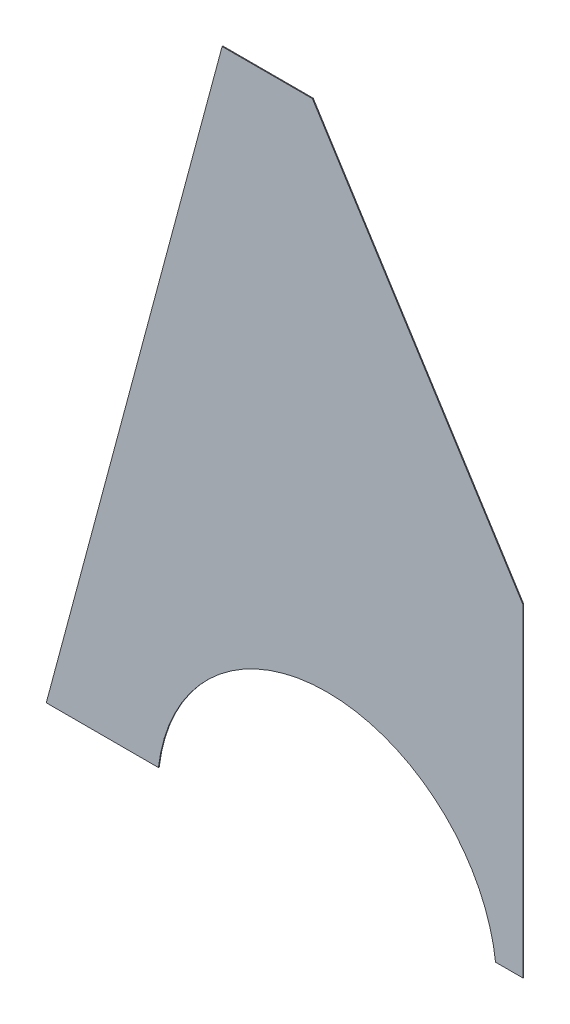
ISO-10303-21;
HEADER;
FILE_DESCRIPTION(('STEP AP214'),'2;1');
FILE_NAME('part.step','',(''),(''),'','','');
FILE_SCHEMA(('AUTOMOTIVE_DESIGN { 1 0 10303 214 1 1 1 1 }'));
ENDSEC;
DATA;
#1=APPLICATION_CONTEXT('core data for automotive mechanical design processes');
#2=APPLICATION_PROTOCOL_DEFINITION('international standard','automotive_design',2000,#1);
#3=PRODUCT_CONTEXT('',#1,'mechanical');
#4=PRODUCT('Part','Part','',(#3));
#5=PRODUCT_RELATED_PRODUCT_CATEGORY('part','',(#4));
#6=PRODUCT_DEFINITION_FORMATION('','',#4);
#7=PRODUCT_DEFINITION_CONTEXT('part definition',#1,'design');
#8=PRODUCT_DEFINITION('design','',#6,#7);
#9=PRODUCT_DEFINITION_SHAPE('','',#8);
#10=(LENGTH_UNIT() NAMED_UNIT(*) SI_UNIT(.MILLI.,.METRE.));
#11=(NAMED_UNIT(*) PLANE_ANGLE_UNIT() SI_UNIT($,.RADIAN.));
#12=(NAMED_UNIT(*) SI_UNIT($,.STERADIAN.) SOLID_ANGLE_UNIT());
#13=UNCERTAINTY_MEASURE_WITH_UNIT(LENGTH_MEASURE(1.E-05),#10,'distance_accuracy_value','');
#14=(GEOMETRIC_REPRESENTATION_CONTEXT(3) GLOBAL_UNCERTAINTY_ASSIGNED_CONTEXT((#13)) GLOBAL_UNIT_ASSIGNED_CONTEXT((#10,
#11,#12)) REPRESENTATION_CONTEXT('',''));
#15=CARTESIAN_POINT('',(0.,0.,0.));
#16=DIRECTION('',(0.,0.,1.));
#17=DIRECTION('',(1.,0.,0.));
#18=AXIS2_PLACEMENT_3D('',#15,#16,#17);
#19=CARTESIAN_POINT('',(-221.038261187071,-391.229199842486,1.5));
#20=DIRECTION('',(0.965925826289067,-0.258819045102525,0.));
#21=DIRECTION('',(0.258819045102525,0.965925826289067,0.));
#22=AXIS2_PLACEMENT_3D('',#19,#20,#21);
#23=PLANE('',#22);
#24=DIRECTION('',(-0.258819045102525,-0.965925826289067,0.));
#25=VECTOR('',#24,1.);
#26=CARTESIAN_POINT('',(-221.038261187071,-391.229199842486,0.));
#27=LINE('',#26,#25);
#28=CARTESIAN_POINT('',(100.414992830264,808.450676408536,0.));
#29=VERTEX_POINT('',#28);
#30=CARTESIAN_POINT('',(-221.038261187071,-391.229199842486,0.));
#31=VERTEX_POINT('',#30);
#32=EDGE_CURVE('E127',#29,#31,#27,.T.);
#33=ORIENTED_EDGE('',*,*,#32,.T.);
#34=DIRECTION('',(0.,0.,-1.));
#35=VECTOR('',#34,1.);
#36=CARTESIAN_POINT('',(-221.038261187071,-391.229199842486,1.5));
#37=LINE('',#36,#35);
#38=CARTESIAN_POINT('',(-221.038261187071,-391.229199842486,1.5));
#39=VERTEX_POINT('',#38);
#40=EDGE_CURVE('E11',#39,#31,#37,.T.);
#41=ORIENTED_EDGE('',*,*,#40,.F.);
#42=DIRECTION('',(-0.258819045102525,-0.965925826289067,0.));
#43=VECTOR('',#42,1.);
#44=CARTESIAN_POINT('',(-221.038261187071,-391.229199842486,1.5));
#45=LINE('',#44,#43);
#46=CARTESIAN_POINT('',(100.414992830264,808.450676408536,1.5));
#47=VERTEX_POINT('',#46);
#48=EDGE_CURVE('E139',#47,#39,#45,.T.);
#49=ORIENTED_EDGE('',*,*,#48,.F.);
#50=DIRECTION('',(0.,0.,-1.));
#51=VECTOR('',#50,1.);
#52=CARTESIAN_POINT('',(100.414992830264,808.450676408536,1.5));
#53=LINE('',#52,#51);
#54=EDGE_CURVE('E123',#47,#29,#53,.T.);
#55=ORIENTED_EDGE('',*,*,#54,.T.);
#56=EDGE_LOOP('',(#33,#41,#49,#55));
#57=FACE_BOUND('',#56,.T.);
#58=ADVANCED_FACE('F37',(#57),#23,.F.);
#59=CARTESIAN_POINT('',(-221.038261187071,-391.229199842486,1.5));
#60=DIRECTION('',(0.,1.,0.));
#61=DIRECTION('',(-1.,0.,0.));
#62=AXIS2_PLACEMENT_3D('',#59,#60,#61);
#63=PLANE('',#62);
#64=DIRECTION('',(1.,0.,0.));
#65=VECTOR('',#64,1.);
#66=CARTESIAN_POINT('',(-221.038261187071,-391.229199842486,0.));
#67=LINE('',#66,#65);
#68=CARTESIAN_POINT('',(-16.0382611870713,-391.229199842487,0.));
#69=VERTEX_POINT('',#68);
#70=EDGE_CURVE('E130',#31,#69,#67,.T.);
#71=ORIENTED_EDGE('',*,*,#70,.T.);
#72=DIRECTION('',(0.,0.,-1.));
#73=VECTOR('',#72,1.);
#74=CARTESIAN_POINT('',(-16.0382611870713,-391.229199842487,1.5));
#75=LINE('',#74,#73);
#76=CARTESIAN_POINT('',(-16.0382611870713,-391.229199842487,1.5));
#77=VERTEX_POINT('',#76);
#78=EDGE_CURVE('E45',#77,#69,#75,.T.);
#79=ORIENTED_EDGE('',*,*,#78,.F.);
#80=DIRECTION('',(1.,0.,0.));
#81=VECTOR('',#80,1.);
#82=CARTESIAN_POINT('',(-221.038261187071,-391.229199842486,1.5));
#83=LINE('',#82,#81);
#84=EDGE_CURVE('E93',#39,#77,#83,.T.);
#85=ORIENTED_EDGE('',*,*,#84,.F.);
#86=ORIENTED_EDGE('',*,*,#40,.T.);
#87=EDGE_LOOP('',(#71,#79,#85,#86));
#88=FACE_BOUND('',#87,.T.);
#89=ADVANCED_FACE('F164',(#88),#63,.F.);
#90=CARTESIAN_POINT('',(292.09890257763,-427.802387643597,1.5));
#91=DIRECTION('',(0.,0.,-1.));
#92=DIRECTION('',(-1.,0.,0.));
#93=AXIS2_PLACEMENT_3D('',#90,#91,#92);
#94=CYLINDRICAL_SURFACE('',#93,310.300031838364);
#95=CARTESIAN_POINT('',(292.09890257763,-427.802387643597,0.));
#96=DIRECTION('',(0.,0.,-1.));
#97=DIRECTION('',(-1.,0.,0.));
#98=AXIS2_PLACEMENT_3D('',#95,#96,#97);
#99=CIRCLE('',#98,310.300031838364);
#100=CARTESIAN_POINT('',(600.236066342331,-391.229199842487,0.));
#101=VERTEX_POINT('',#100);
#102=EDGE_CURVE('E132',#69,#101,#99,.T.);
#103=ORIENTED_EDGE('',*,*,#102,.T.);
#104=DIRECTION('',(0.,0.,-1.));
#105=VECTOR('',#104,1.);
#106=CARTESIAN_POINT('',(600.236066342331,-391.229199842487,1.5));
#107=LINE('',#106,#105);
#108=CARTESIAN_POINT('',(600.236066342331,-391.229199842487,1.5));
#109=VERTEX_POINT('',#108);
#110=EDGE_CURVE('E143',#109,#101,#107,.T.);
#111=ORIENTED_EDGE('',*,*,#110,.F.);
#112=CARTESIAN_POINT('',(292.09890257763,-427.802387643597,1.5));
#113=DIRECTION('',(0.,0.,-1.));
#114=DIRECTION('',(-1.,0.,0.));
#115=AXIS2_PLACEMENT_3D('',#112,#113,#114);
#116=CIRCLE('',#115,310.300031838364);
#117=EDGE_CURVE('E151',#77,#109,#116,.T.);
#118=ORIENTED_EDGE('',*,*,#117,.F.);
#119=ORIENTED_EDGE('',*,*,#78,.T.);
#120=EDGE_LOOP('',(#103,#111,#118,#119));
#121=FACE_BOUND('',#120,.T.);
#122=ADVANCED_FACE('F149',(#121),#94,.F.);
#123=CARTESIAN_POINT('',(650.236066342331,-391.229199842487,1.5));
#124=DIRECTION('',(0.,1.,0.));
#125=DIRECTION('',(0.,0.,1.));
#126=AXIS2_PLACEMENT_3D('',#123,#124,#125);
#127=PLANE('',#126);
#128=DIRECTION('',(1.,0.,0.));
#129=VECTOR('',#128,1.);
#130=CARTESIAN_POINT('',(650.236066342331,-391.229199842487,0.));
#131=LINE('',#130,#129);
#132=CARTESIAN_POINT('',(650.236066342331,-391.229199842487,0.));
#133=VERTEX_POINT('',#132);
#134=EDGE_CURVE('E134',#101,#133,#131,.T.);
#135=ORIENTED_EDGE('',*,*,#134,.T.);
#136=DIRECTION('',(0.,0.,-1.));
#137=VECTOR('',#136,1.);
#138=CARTESIAN_POINT('',(650.236066342331,-391.229199842487,1.5));
#139=LINE('',#138,#137);
#140=CARTESIAN_POINT('',(650.236066342331,-391.229199842487,1.5));
#141=VERTEX_POINT('',#140);
#142=EDGE_CURVE('E118',#141,#133,#139,.T.);
#143=ORIENTED_EDGE('',*,*,#142,.F.);
#144=DIRECTION('',(1.,0.,0.));
#145=VECTOR('',#144,1.);
#146=CARTESIAN_POINT('',(650.236066342331,-391.229199842487,1.5));
#147=LINE('',#146,#145);
#148=EDGE_CURVE('E109',#109,#141,#147,.T.);
#149=ORIENTED_EDGE('',*,*,#148,.F.);
#150=ORIENTED_EDGE('',*,*,#110,.T.);
#151=EDGE_LOOP('',(#135,#143,#149,#150));
#152=FACE_BOUND('',#151,.T.);
#153=ADVANCED_FACE('F157',(#152),#127,.F.);
#154=CARTESIAN_POINT('',(650.236066342331,199.917405846424,1.5));
#155=DIRECTION('',(-1.,0.,0.));
#156=DIRECTION('',(0.,0.,1.));
#157=AXIS2_PLACEMENT_3D('',#154,#155,#156);
#158=PLANE('',#157);
#159=DIRECTION('',(0.,1.,0.));
#160=VECTOR('',#159,1.);
#161=CARTESIAN_POINT('',(650.236066342331,199.917405846424,0.));
#162=LINE('',#161,#160);
#163=CARTESIAN_POINT('',(650.236066342331,199.917405846424,0.));
#164=VERTEX_POINT('',#163);
#165=EDGE_CURVE('E117',#133,#164,#162,.T.);
#166=ORIENTED_EDGE('',*,*,#165,.T.);
#167=DIRECTION('',(0.,0.,-1.));
#168=VECTOR('',#167,1.);
#169=CARTESIAN_POINT('',(650.236066342331,199.917405846424,1.5));
#170=LINE('',#169,#168);
#171=CARTESIAN_POINT('',(650.236066342331,199.917405846424,1.5));
#172=VERTEX_POINT('',#171);
#173=EDGE_CURVE('E114',#172,#164,#170,.T.);
#174=ORIENTED_EDGE('',*,*,#173,.F.);
#175=DIRECTION('',(0.,1.,0.));
#176=VECTOR('',#175,1.);
#177=CARTESIAN_POINT('',(650.236066342331,199.917405846424,1.5));
#178=LINE('',#177,#176);
#179=EDGE_CURVE('E103',#141,#172,#178,.T.);
#180=ORIENTED_EDGE('',*,*,#179,.F.);
#181=ORIENTED_EDGE('',*,*,#142,.T.);
#182=EDGE_LOOP('',(#166,#174,#180,#181));
#183=FACE_BOUND('',#182,.T.);
#184=ADVANCED_FACE('F115',(#183),#158,.F.);
#185=CARTESIAN_POINT('',(265.414992830264,808.450676408536,1.5));
#186=DIRECTION('',(-0.845185098002934,-0.534473713211203,0.));
#187=DIRECTION('',(0.534473713211203,-0.845185098002934,0.));
#188=AXIS2_PLACEMENT_3D('',#185,#186,#187);
#189=PLANE('',#188);
#190=DIRECTION('',(-0.534473713211203,0.845185098002934,0.));
#191=VECTOR('',#190,1.);
#192=CARTESIAN_POINT('',(265.414992830264,808.450676408536,0.));
#193=LINE('',#192,#191);
#194=CARTESIAN_POINT('',(265.414992830264,808.450676408536,0.));
#195=VERTEX_POINT('',#194);
#196=EDGE_CURVE('E79',#164,#195,#193,.T.);
#197=ORIENTED_EDGE('',*,*,#196,.T.);
#198=DIRECTION('',(0.,0.,-1.));
#199=VECTOR('',#198,1.);
#200=CARTESIAN_POINT('',(265.414992830264,808.450676408536,1.5));
#201=LINE('',#200,#199);
#202=CARTESIAN_POINT('',(265.414992830264,808.450676408536,1.5));
#203=VERTEX_POINT('',#202);
#204=EDGE_CURVE('E119',#203,#195,#201,.T.);
#205=ORIENTED_EDGE('',*,*,#204,.F.);
#206=DIRECTION('',(-0.534473713211203,0.845185098002934,0.));
#207=VECTOR('',#206,1.);
#208=CARTESIAN_POINT('',(265.414992830264,808.450676408536,1.5));
#209=LINE('',#208,#207);
#210=EDGE_CURVE('E107',#172,#203,#209,.T.);
#211=ORIENTED_EDGE('',*,*,#210,.F.);
#212=ORIENTED_EDGE('',*,*,#173,.T.);
#213=EDGE_LOOP('',(#197,#205,#211,#212));
#214=FACE_BOUND('',#213,.T.);
#215=ADVANCED_FACE('F121',(#214),#189,.F.);
#216=CARTESIAN_POINT('',(100.414992830264,808.450676408536,1.5));
#217=DIRECTION('',(0.,-1.,0.));
#218=DIRECTION('',(0.,0.,-1.));
#219=AXIS2_PLACEMENT_3D('',#216,#217,#218);
#220=PLANE('',#219);
#221=DIRECTION('',(-1.,0.,0.));
#222=VECTOR('',#221,1.);
#223=CARTESIAN_POINT('',(100.414992830264,808.450676408536,0.));
#224=LINE('',#223,#222);
#225=EDGE_CURVE('E85',#195,#29,#224,.T.);
#226=ORIENTED_EDGE('',*,*,#225,.T.);
#227=ORIENTED_EDGE('',*,*,#54,.F.);
#228=DIRECTION('',(-1.,0.,0.));
#229=VECTOR('',#228,1.);
#230=CARTESIAN_POINT('',(100.414992830264,808.450676408536,1.5));
#231=LINE('',#230,#229);
#232=EDGE_CURVE('E53',#203,#47,#231,.T.);
#233=ORIENTED_EDGE('',*,*,#232,.F.);
#234=ORIENTED_EDGE('',*,*,#204,.T.);
#235=EDGE_LOOP('',(#226,#227,#233,#234));
#236=FACE_BOUND('',#235,.T.);
#237=ADVANCED_FACE('F178',(#236),#220,.F.);
#238=CARTESIAN_POINT('',(292.09890257763,-427.802387643597,1.5));
#239=DIRECTION('',(0.,0.,-1.));
#240=DIRECTION('',(-1.,0.,0.));
#241=AXIS2_PLACEMENT_3D('',#238,#239,#240);
#242=PLANE('',#241);
#243=ORIENTED_EDGE('',*,*,#48,.T.);
#244=ORIENTED_EDGE('',*,*,#84,.T.);
#245=ORIENTED_EDGE('',*,*,#117,.T.);
#246=ORIENTED_EDGE('',*,*,#148,.T.);
#247=ORIENTED_EDGE('',*,*,#179,.T.);
#248=ORIENTED_EDGE('',*,*,#210,.T.);
#249=ORIENTED_EDGE('',*,*,#232,.T.);
#250=EDGE_LOOP('',(#243,#244,#245,#246,#247,#248,#249));
#251=FACE_BOUND('',#250,.T.);
#252=ADVANCED_FACE('F105',(#251),#242,.F.);
#253=CARTESIAN_POINT('',(292.09890257763,-427.802387643597,0.));
#254=DIRECTION('',(0.,0.,-1.));
#255=DIRECTION('',(-1.,0.,0.));
#256=AXIS2_PLACEMENT_3D('',#253,#254,#255);
#257=PLANE('',#256);
#258=ORIENTED_EDGE('',*,*,#32,.F.);
#259=ORIENTED_EDGE('',*,*,#225,.F.);
#260=ORIENTED_EDGE('',*,*,#196,.F.);
#261=ORIENTED_EDGE('',*,*,#165,.F.);
#262=ORIENTED_EDGE('',*,*,#134,.F.);
#263=ORIENTED_EDGE('',*,*,#102,.F.);
#264=ORIENTED_EDGE('',*,*,#70,.F.);
#265=EDGE_LOOP('',(#258,#259,#260,#261,#262,#263,#264));
#266=FACE_BOUND('',#265,.T.);
#267=ADVANCED_FACE('F155',(#266),#257,.T.);
#268=CLOSED_SHELL('',(#58,#89,#122,#153,#184,#215,#237,#252,#267));
#269=MANIFOLD_SOLID_BREP('B2',#268);
#270=ADVANCED_BREP_SHAPE_REPRESENTATION('',(#18,#269),#14);
#271=SHAPE_DEFINITION_REPRESENTATION(#9,#270);
ENDSEC;
END-ISO-10303-21;
